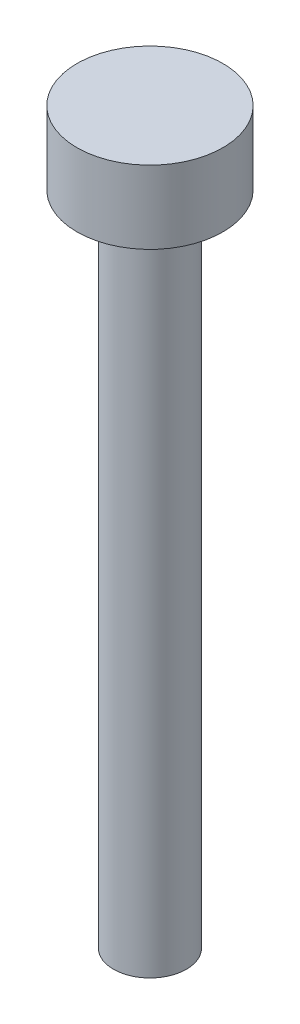
ISO-10303-21;
HEADER;
FILE_DESCRIPTION(('STEP AP214'),'2;1');
FILE_NAME('part.step','',(''),(''),'','','');
FILE_SCHEMA(('AUTOMOTIVE_DESIGN { 1 0 10303 214 1 1 1 1 }'));
ENDSEC;
DATA;
#1=APPLICATION_CONTEXT('core data for automotive mechanical design processes');
#2=APPLICATION_PROTOCOL_DEFINITION('international standard','automotive_design',2000,#1);
#3=PRODUCT_CONTEXT('',#1,'mechanical');
#4=PRODUCT('Part','Part','',(#3));
#5=PRODUCT_RELATED_PRODUCT_CATEGORY('part','',(#4));
#6=PRODUCT_DEFINITION_FORMATION('','',#4);
#7=PRODUCT_DEFINITION_CONTEXT('part definition',#1,'design');
#8=PRODUCT_DEFINITION('design','',#6,#7);
#9=PRODUCT_DEFINITION_SHAPE('','',#8);
#10=(LENGTH_UNIT() NAMED_UNIT(*) SI_UNIT(.MILLI.,.METRE.));
#11=(NAMED_UNIT(*) PLANE_ANGLE_UNIT() SI_UNIT($,.RADIAN.));
#12=(NAMED_UNIT(*) SI_UNIT($,.STERADIAN.) SOLID_ANGLE_UNIT());
#13=UNCERTAINTY_MEASURE_WITH_UNIT(LENGTH_MEASURE(1.E-05),#10,'distance_accuracy_value','');
#14=(GEOMETRIC_REPRESENTATION_CONTEXT(3) GLOBAL_UNCERTAINTY_ASSIGNED_CONTEXT((#13)) GLOBAL_UNIT_ASSIGNED_CONTEXT((#10,
#11,#12)) REPRESENTATION_CONTEXT('',''));
#15=CARTESIAN_POINT('',(0.,0.,0.));
#16=DIRECTION('',(0.,0.,1.));
#17=DIRECTION('',(1.,0.,0.));
#18=AXIS2_PLACEMENT_3D('',#15,#16,#17);
#19=CARTESIAN_POINT('',(0.,5.,0.));
#20=DIRECTION('',(0.,-1.,0.));
#21=DIRECTION('',(0.,0.,-1.));
#22=AXIS2_PLACEMENT_3D('',#19,#20,#21);
#23=CYLINDRICAL_SURFACE('',#22,5.);
#24=CARTESIAN_POINT('',(0.,5.,0.));
#25=DIRECTION('',(0.,1.,0.));
#26=DIRECTION('',(0.,0.,1.));
#27=AXIS2_PLACEMENT_3D('',#24,#25,#26);
#28=CIRCLE('',#27,5.);
#29=CARTESIAN_POINT('',(0.,5.,5.));
#30=VERTEX_POINT('',#29);
#31=EDGE_CURVE('E37',#30,#30,#28,.T.);
#32=ORIENTED_EDGE('',*,*,#31,.F.);
#33=EDGE_LOOP('',(#32));
#34=FACE_BOUND('',#33,.T.);
#35=CARTESIAN_POINT('',(0.,0.,0.));
#36=DIRECTION('',(0.,1.,0.));
#37=DIRECTION('',(0.,0.,1.));
#38=AXIS2_PLACEMENT_3D('',#35,#36,#37);
#39=CIRCLE('',#38,5.);
#40=CARTESIAN_POINT('',(0.,0.,5.));
#41=VERTEX_POINT('',#40);
#42=EDGE_CURVE('E41',#41,#41,#39,.T.);
#43=ORIENTED_EDGE('',*,*,#42,.T.);
#44=EDGE_LOOP('',(#43));
#45=FACE_BOUND('',#44,.T.);
#46=ADVANCED_FACE('F31',(#34,#45),#23,.T.);
#47=CARTESIAN_POINT('',(0.,5.,0.));
#48=DIRECTION('',(0.,1.,0.));
#49=DIRECTION('',(0.,0.,1.));
#50=AXIS2_PLACEMENT_3D('',#47,#48,#49);
#51=PLANE('',#50);
#52=ORIENTED_EDGE('',*,*,#31,.T.);
#53=EDGE_LOOP('',(#52));
#54=FACE_BOUND('',#53,.T.);
#55=ADVANCED_FACE('F62',(#54),#51,.T.);
#56=CARTESIAN_POINT('',(0.,0.,0.));
#57=DIRECTION('',(0.,1.,0.));
#58=DIRECTION('',(0.,0.,1.));
#59=AXIS2_PLACEMENT_3D('',#56,#57,#58);
#60=PLANE('',#59);
#61=CARTESIAN_POINT('',(0.,0.,0.));
#62=DIRECTION('',(0.,1.,0.));
#63=DIRECTION('',(0.,0.,1.));
#64=AXIS2_PLACEMENT_3D('',#61,#62,#63);
#65=CIRCLE('',#64,2.5);
#66=CARTESIAN_POINT('',(0.,0.,2.5));
#67=VERTEX_POINT('',#66);
#68=EDGE_CURVE('E10',#67,#67,#65,.F.);
#69=ORIENTED_EDGE('',*,*,#68,.F.);
#70=EDGE_LOOP('',(#69));
#71=FACE_BOUND('',#70,.T.);
#72=ORIENTED_EDGE('',*,*,#42,.F.);
#73=EDGE_LOOP('',(#72));
#74=FACE_BOUND('',#73,.T.);
#75=ADVANCED_FACE('F55',(#71,#74),#60,.F.);
#76=CARTESIAN_POINT('',(0.,-45.,0.));
#77=DIRECTION('',(0.,1.,0.));
#78=DIRECTION('',(0.,0.,1.));
#79=AXIS2_PLACEMENT_3D('',#76,#77,#78);
#80=CYLINDRICAL_SURFACE('',#79,2.5);
#81=CARTESIAN_POINT('',(0.,-45.,0.));
#82=DIRECTION('',(0.,-1.,0.));
#83=DIRECTION('',(0.,0.,-1.));
#84=AXIS2_PLACEMENT_3D('',#81,#82,#83);
#85=CIRCLE('',#84,2.5);
#86=CARTESIAN_POINT('',(0.,-45.,2.5));
#87=VERTEX_POINT('',#86);
#88=EDGE_CURVE('E46',#87,#87,#85,.T.);
#89=CARTESIAN_POINT('',(0.,-45.,2.5));
#90=CARTESIAN_POINT('',(0.,-44.53125,2.5));
#91=CARTESIAN_POINT('',(0.,-44.0625,2.5));
#92=CARTESIAN_POINT('',(0.,-43.125,2.5));
#93=CARTESIAN_POINT('',(0.,-42.65625,2.5));
#94=CARTESIAN_POINT('',(0.,-41.71875,2.5));
#95=CARTESIAN_POINT('',(0.,-41.25,2.5));
#96=CARTESIAN_POINT('',(0.,-40.3125,2.5));
#97=CARTESIAN_POINT('',(0.,-39.84375,2.5));
#98=CARTESIAN_POINT('',(0.,-38.90625,2.5));
#99=CARTESIAN_POINT('',(0.,-38.4375,2.5));
#100=CARTESIAN_POINT('',(0.,-37.5,2.5));
#101=CARTESIAN_POINT('',(0.,-37.03125,2.5));
#102=CARTESIAN_POINT('',(0.,-36.09375,2.5));
#103=CARTESIAN_POINT('',(0.,-35.625,2.5));
#104=CARTESIAN_POINT('',(0.,-34.6875,2.5));
#105=CARTESIAN_POINT('',(0.,-34.21875,2.5));
#106=CARTESIAN_POINT('',(0.,-33.28125,2.5));
#107=CARTESIAN_POINT('',(0.,-32.8125,2.5));
#108=CARTESIAN_POINT('',(0.,-31.875,2.5));
#109=CARTESIAN_POINT('',(0.,-31.40625,2.5));
#110=CARTESIAN_POINT('',(0.,-30.46875,2.5));
#111=CARTESIAN_POINT('',(0.,-30.,2.5));
#112=CARTESIAN_POINT('',(0.,-29.0625,2.5));
#113=CARTESIAN_POINT('',(0.,-28.59375,2.5));
#114=CARTESIAN_POINT('',(0.,-27.65625,2.5));
#115=CARTESIAN_POINT('',(0.,-27.1875,2.5));
#116=CARTESIAN_POINT('',(0.,-26.25,2.5));
#117=CARTESIAN_POINT('',(0.,-25.78125,2.5));
#118=CARTESIAN_POINT('',(0.,-24.84375,2.5));
#119=CARTESIAN_POINT('',(0.,-24.375,2.5));
#120=CARTESIAN_POINT('',(0.,-23.4375,2.5));
#121=CARTESIAN_POINT('',(0.,-22.96875,2.5));
#122=CARTESIAN_POINT('',(0.,-22.03125,2.5));
#123=CARTESIAN_POINT('',(0.,-21.5625,2.5));
#124=CARTESIAN_POINT('',(0.,-20.625,2.5));
#125=CARTESIAN_POINT('',(0.,-20.15625,2.5));
#126=CARTESIAN_POINT('',(0.,-19.21875,2.5));
#127=CARTESIAN_POINT('',(0.,-18.75,2.5));
#128=CARTESIAN_POINT('',(0.,-17.8125,2.5));
#129=CARTESIAN_POINT('',(0.,-17.34375,2.5));
#130=CARTESIAN_POINT('',(0.,-16.40625,2.5));
#131=CARTESIAN_POINT('',(0.,-15.9375,2.5));
#132=CARTESIAN_POINT('',(0.,-15.,2.5));
#133=CARTESIAN_POINT('',(0.,-14.53125,2.5));
#134=CARTESIAN_POINT('',(0.,-13.59375,2.5));
#135=CARTESIAN_POINT('',(0.,-13.125,2.5));
#136=CARTESIAN_POINT('',(0.,-12.1875,2.5));
#137=CARTESIAN_POINT('',(0.,-11.71875,2.5));
#138=CARTESIAN_POINT('',(0.,-10.78125,2.5));
#139=CARTESIAN_POINT('',(0.,-10.3125,2.5));
#140=CARTESIAN_POINT('',(0.,-9.37500000000001,2.5));
#141=CARTESIAN_POINT('',(0.,-8.90625000000001,2.5));
#142=CARTESIAN_POINT('',(0.,-7.96875000000001,2.5));
#143=CARTESIAN_POINT('',(0.,-7.5,2.5));
#144=CARTESIAN_POINT('',(0.,-6.5625,2.5));
#145=CARTESIAN_POINT('',(0.,-6.09375,2.5));
#146=CARTESIAN_POINT('',(0.,-5.15625000000001,2.5));
#147=CARTESIAN_POINT('',(0.,-4.68750000000001,2.5));
#148=CARTESIAN_POINT('',(0.,-3.75000000000001,2.5));
#149=CARTESIAN_POINT('',(0.,-3.28125000000001,2.5));
#150=CARTESIAN_POINT('',(0.,-2.34375000000001,2.5));
#151=CARTESIAN_POINT('',(0.,-1.87500000000001,2.5));
#152=CARTESIAN_POINT('',(0.,-0.937500000000006,2.5));
#153=CARTESIAN_POINT('',(0.,-0.468750000000007,2.5));
#154=CARTESIAN_POINT('',(0.,0.,2.5));
#155=B_SPLINE_CURVE_WITH_KNOTS('',3,(#89,#90,#91,#92,#93,#94,#95,#96,#97,#98,#99,#100,#101,#102,
#103,#104,#105,#106,#107,#108,#109,#110,#111,#112,#113,#114,#115,#116,#117,#118,#119,#120,#121,
#122,#123,#124,#125,#126,#127,#128,#129,#130,#131,#132,#133,#134,#135,#136,#137,#138,#139,#140,
#141,#142,#143,#144,#145,#146,#147,#148,#149,#150,#151,#152,#153,#154),.UNSPECIFIED.,.F.,.F.,(4,
2,2,2,2,2,2,2,2,2,2,2,2,2,2,2,2,2,2,2,2,2,2,2,2,2,2,2,2,2,2,2,4),(0.,1.40625,2.8125,
4.21874999999999,5.625,7.03125,8.43749999999999,9.84374999999999,11.25,12.65625,14.0625,
15.46875,16.875,18.28125,19.6875,21.09375,22.5,23.90625,25.3125,26.71875,28.125,29.53125,
30.9375,32.34375,33.75,35.15625,36.5625,37.96875,39.375,40.78125,42.1875,43.59375,45.),.UNSPECIFIED.);
#156=EDGE_CURVE('BSEAM53',#87,#67,#155,.T.);
#157=ORIENTED_EDGE('',*,*,#88,.F.);
#158=ORIENTED_EDGE('',*,*,#68,.T.);
#159=ORIENTED_EDGE('',*,*,#156,.T.);
#160=ORIENTED_EDGE('',*,*,#156,.F.);
#161=EDGE_LOOP('',(#157,#159,#158,#160));
#162=FACE_BOUND('',#161,.T.);
#163=ADVANCED_FACE('F53',(#162),#80,.T.);
#164=CARTESIAN_POINT('',(0.,-45.,0.));
#165=DIRECTION('',(0.,-1.,0.));
#166=DIRECTION('',(0.,0.,-1.));
#167=AXIS2_PLACEMENT_3D('',#164,#165,#166);
#168=PLANE('',#167);
#169=ORIENTED_EDGE('',*,*,#88,.T.);
#170=EDGE_LOOP('',(#169));
#171=FACE_BOUND('',#170,.T.);
#172=ADVANCED_FACE('F51',(#171),#168,.T.);
#173=CLOSED_SHELL('',(#46,#55,#75,#163,#172));
#174=MANIFOLD_SOLID_BREP('B2',#173);
#175=ADVANCED_BREP_SHAPE_REPRESENTATION('',(#18,#174),#14);
#176=SHAPE_DEFINITION_REPRESENTATION(#9,#175);
ENDSEC;
END-ISO-10303-21;
